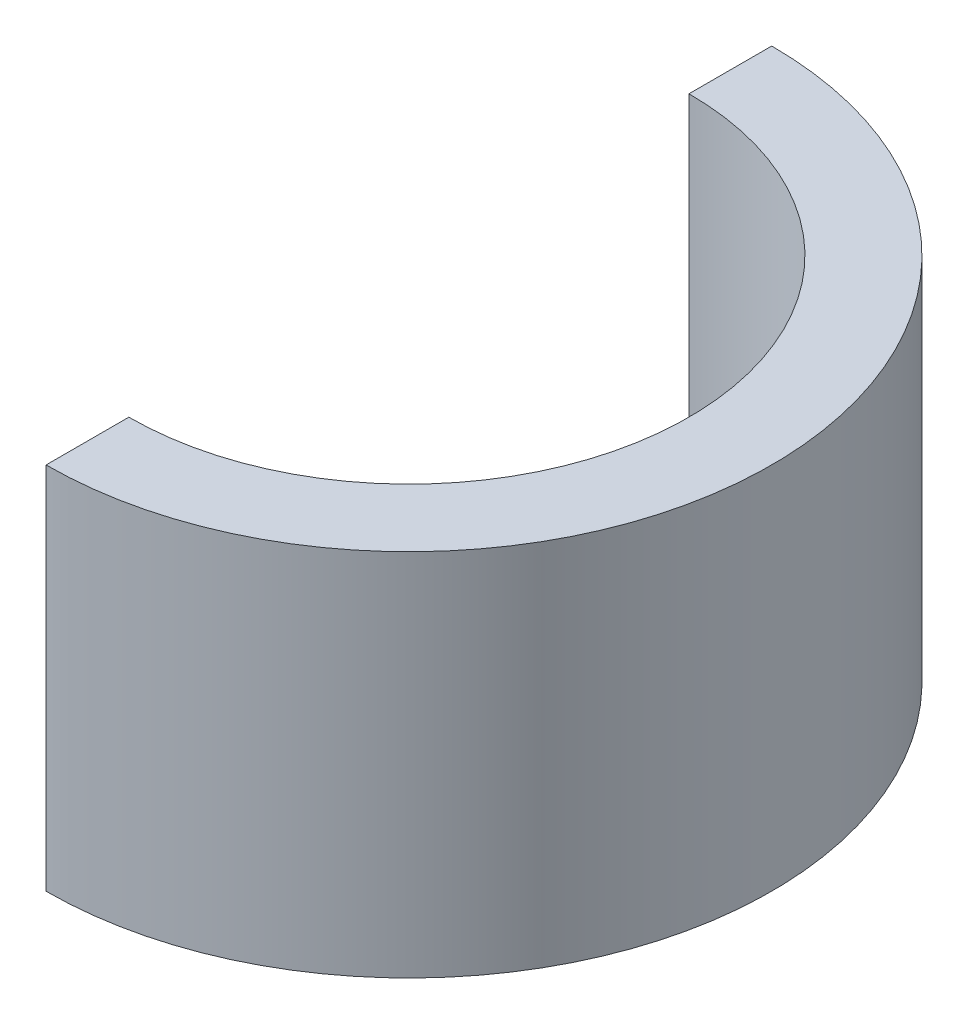
ISO-10303-21;
HEADER;
FILE_DESCRIPTION(('STEP AP214'),'2;1');
FILE_NAME('part.step','',(''),(''),'','','');
FILE_SCHEMA(('AUTOMOTIVE_DESIGN { 1 0 10303 214 1 1 1 1 }'));
ENDSEC;
DATA;
#1=APPLICATION_CONTEXT('core data for automotive mechanical design processes');
#2=APPLICATION_PROTOCOL_DEFINITION('international standard','automotive_design',2000,#1);
#3=PRODUCT_CONTEXT('',#1,'mechanical');
#4=PRODUCT('Part','Part','',(#3));
#5=PRODUCT_RELATED_PRODUCT_CATEGORY('part','',(#4));
#6=PRODUCT_DEFINITION_FORMATION('','',#4);
#7=PRODUCT_DEFINITION_CONTEXT('part definition',#1,'design');
#8=PRODUCT_DEFINITION('design','',#6,#7);
#9=PRODUCT_DEFINITION_SHAPE('','',#8);
#10=(LENGTH_UNIT() NAMED_UNIT(*) SI_UNIT(.MILLI.,.METRE.));
#11=(NAMED_UNIT(*) PLANE_ANGLE_UNIT() SI_UNIT($,.RADIAN.));
#12=(NAMED_UNIT(*) SI_UNIT($,.STERADIAN.) SOLID_ANGLE_UNIT());
#13=UNCERTAINTY_MEASURE_WITH_UNIT(LENGTH_MEASURE(1.E-05),#10,'distance_accuracy_value','');
#14=(GEOMETRIC_REPRESENTATION_CONTEXT(3) GLOBAL_UNCERTAINTY_ASSIGNED_CONTEXT((#13)) GLOBAL_UNIT_ASSIGNED_CONTEXT((#10,
#11,#12)) REPRESENTATION_CONTEXT('',''));
#15=CARTESIAN_POINT('',(0.,0.,0.));
#16=DIRECTION('',(0.,0.,1.));
#17=DIRECTION('',(1.,0.,0.));
#18=AXIS2_PLACEMENT_3D('',#15,#16,#17);
#19=CARTESIAN_POINT('',(0.,33.9557590618073,-28.51));
#20=DIRECTION('',(-1.,0.,0.));
#21=DIRECTION('',(0.,0.,1.));
#22=AXIS2_PLACEMENT_3D('',#19,#20,#21);
#23=PLANE('',#22);
#24=DIRECTION('',(0.,0.,1.));
#25=VECTOR('',#24,1.);
#26=CARTESIAN_POINT('',(0.,29.,0.));
#27=LINE('',#26,#25);
#28=CARTESIAN_POINT('',(0.,29.,-28.5));
#29=VERTEX_POINT('',#28);
#30=CARTESIAN_POINT('',(0.,29.,-22.));
#31=VERTEX_POINT('',#30);
#32=EDGE_CURVE('E98',#29,#31,#27,.T.);
#33=ORIENTED_EDGE('',*,*,#32,.F.);
#34=DIRECTION('',(0.,-1.,0.));
#35=VECTOR('',#34,1.);
#36=CARTESIAN_POINT('',(0.,29.,-28.5));
#37=LINE('',#36,#35);
#38=CARTESIAN_POINT('',(0.,0.,-28.5));
#39=VERTEX_POINT('',#38);
#40=EDGE_CURVE('E88',#29,#39,#37,.T.);
#41=ORIENTED_EDGE('',*,*,#40,.T.);
#42=DIRECTION('',(0.,0.,1.));
#43=VECTOR('',#42,1.);
#44=CARTESIAN_POINT('',(0.,0.,0.));
#45=LINE('',#44,#43);
#46=CARTESIAN_POINT('',(0.,0.,-22.));
#47=VERTEX_POINT('',#46);
#48=EDGE_CURVE('E115',#39,#47,#45,.T.);
#49=ORIENTED_EDGE('',*,*,#48,.T.);
#50=DIRECTION('',(0.,-1.,0.));
#51=VECTOR('',#50,1.);
#52=CARTESIAN_POINT('',(0.,29.,-22.));
#53=LINE('',#52,#51);
#54=EDGE_CURVE('E62',#31,#47,#53,.T.);
#55=ORIENTED_EDGE('',*,*,#54,.F.);
#56=EDGE_LOOP('',(#33,#41,#49,#55));
#57=FACE_BOUND('',#56,.T.);
#58=ADVANCED_FACE('F38',(#57),#23,.T.);
#59=CARTESIAN_POINT('',(0.,29.,22.));
#60=VERTEX_POINT('',#59);
#61=CARTESIAN_POINT('',(0.,29.,28.5));
#62=VERTEX_POINT('',#61);
#63=EDGE_CURVE('E94',#60,#62,#27,.T.);
#64=ORIENTED_EDGE('',*,*,#63,.F.);
#65=DIRECTION('',(0.,-1.,0.));
#66=VECTOR('',#65,1.);
#67=CARTESIAN_POINT('',(0.,29.,22.));
#68=LINE('',#67,#66);
#69=CARTESIAN_POINT('',(0.,0.,22.));
#70=VERTEX_POINT('',#69);
#71=EDGE_CURVE('E54',#70,#60,#68,.F.);
#72=ORIENTED_EDGE('',*,*,#71,.F.);
#73=CARTESIAN_POINT('',(0.,0.,28.5));
#74=VERTEX_POINT('',#73);
#75=EDGE_CURVE('E103',#70,#74,#45,.T.);
#76=ORIENTED_EDGE('',*,*,#75,.T.);
#77=DIRECTION('',(0.,-1.,0.));
#78=VECTOR('',#77,1.);
#79=CARTESIAN_POINT('',(0.,29.,28.5));
#80=LINE('',#79,#78);
#81=EDGE_CURVE('E86',#74,#62,#80,.F.);
#82=ORIENTED_EDGE('',*,*,#81,.T.);
#83=EDGE_LOOP('',(#64,#72,#76,#82));
#84=FACE_BOUND('',#83,.T.);
#85=ADVANCED_FACE('F101',(#84),#23,.T.);
#86=CARTESIAN_POINT('',(0.,0.,0.));
#87=DIRECTION('',(0.,1.,0.));
#88=DIRECTION('',(0.,0.,1.));
#89=AXIS2_PLACEMENT_3D('',#86,#87,#88);
#90=PLANE('',#89);
#91=ORIENTED_EDGE('',*,*,#48,.F.);
#92=CARTESIAN_POINT('',(0.,0.,0.));
#93=DIRECTION('',(0.,1.,0.));
#94=DIRECTION('',(0.,0.,1.));
#95=AXIS2_PLACEMENT_3D('',#92,#93,#94);
#96=CIRCLE('',#95,28.5);
#97=EDGE_CURVE('E91',#74,#39,#96,.T.);
#98=ORIENTED_EDGE('',*,*,#97,.F.);
#99=ORIENTED_EDGE('',*,*,#75,.F.);
#100=CARTESIAN_POINT('',(0.,0.,0.));
#101=DIRECTION('',(0.,1.,0.));
#102=DIRECTION('',(0.,0.,1.));
#103=AXIS2_PLACEMENT_3D('',#100,#101,#102);
#104=CIRCLE('',#103,22.);
#105=EDGE_CURVE('E11',#70,#47,#104,.T.);
#106=ORIENTED_EDGE('',*,*,#105,.T.);
#107=EDGE_LOOP('',(#91,#98,#99,#106));
#108=FACE_BOUND('',#107,.T.);
#109=ADVANCED_FACE('F118',(#108),#90,.F.);
#110=CARTESIAN_POINT('',(0.,29.,0.));
#111=DIRECTION('',(0.,1.,0.));
#112=DIRECTION('',(0.,0.,1.));
#113=AXIS2_PLACEMENT_3D('',#110,#111,#112);
#114=PLANE('',#113);
#115=CARTESIAN_POINT('',(0.,29.,0.));
#116=DIRECTION('',(0.,1.,0.));
#117=DIRECTION('',(0.,0.,1.));
#118=AXIS2_PLACEMENT_3D('',#115,#116,#117);
#119=CIRCLE('',#118,28.5);
#120=EDGE_CURVE('E82',#62,#29,#119,.T.);
#121=ORIENTED_EDGE('',*,*,#120,.T.);
#122=ORIENTED_EDGE('',*,*,#32,.T.);
#123=CARTESIAN_POINT('',(0.,29.,0.));
#124=DIRECTION('',(0.,1.,0.));
#125=DIRECTION('',(0.,0.,1.));
#126=AXIS2_PLACEMENT_3D('',#123,#124,#125);
#127=CIRCLE('',#126,22.);
#128=EDGE_CURVE('E47',#60,#31,#127,.T.);
#129=ORIENTED_EDGE('',*,*,#128,.F.);
#130=ORIENTED_EDGE('',*,*,#63,.T.);
#131=EDGE_LOOP('',(#121,#122,#129,#130));
#132=FACE_BOUND('',#131,.T.);
#133=ADVANCED_FACE('F95',(#132),#114,.T.);
#134=CARTESIAN_POINT('',(0.,29.,0.));
#135=DIRECTION('',(0.,-1.,0.));
#136=DIRECTION('',(0.,0.,-1.));
#137=AXIS2_PLACEMENT_3D('',#134,#135,#136);
#138=CYLINDRICAL_SURFACE('',#137,22.);
#139=ORIENTED_EDGE('',*,*,#128,.T.);
#140=ORIENTED_EDGE('',*,*,#54,.T.);
#141=ORIENTED_EDGE('',*,*,#105,.F.);
#142=ORIENTED_EDGE('',*,*,#71,.T.);
#143=EDGE_LOOP('',(#139,#140,#141,#142));
#144=FACE_BOUND('',#143,.T.);
#145=ADVANCED_FACE('F40',(#144),#138,.F.);
#146=CARTESIAN_POINT('',(0.,29.,0.));
#147=DIRECTION('',(0.,-1.,0.));
#148=DIRECTION('',(0.,0.,-1.));
#149=AXIS2_PLACEMENT_3D('',#146,#147,#148);
#150=CYLINDRICAL_SURFACE('',#149,28.5);
#151=ORIENTED_EDGE('',*,*,#40,.F.);
#152=ORIENTED_EDGE('',*,*,#120,.F.);
#153=ORIENTED_EDGE('',*,*,#81,.F.);
#154=ORIENTED_EDGE('',*,*,#97,.T.);
#155=EDGE_LOOP('',(#151,#152,#153,#154));
#156=FACE_BOUND('',#155,.T.);
#157=ADVANCED_FACE('F84',(#156),#150,.T.);
#158=CLOSED_SHELL('',(#58,#85,#109,#133,#145,#157));
#159=MANIFOLD_SOLID_BREP('B2',#158);
#160=ADVANCED_BREP_SHAPE_REPRESENTATION('',(#18,#159),#14);
#161=SHAPE_DEFINITION_REPRESENTATION(#9,#160);
ENDSEC;
END-ISO-10303-21;
